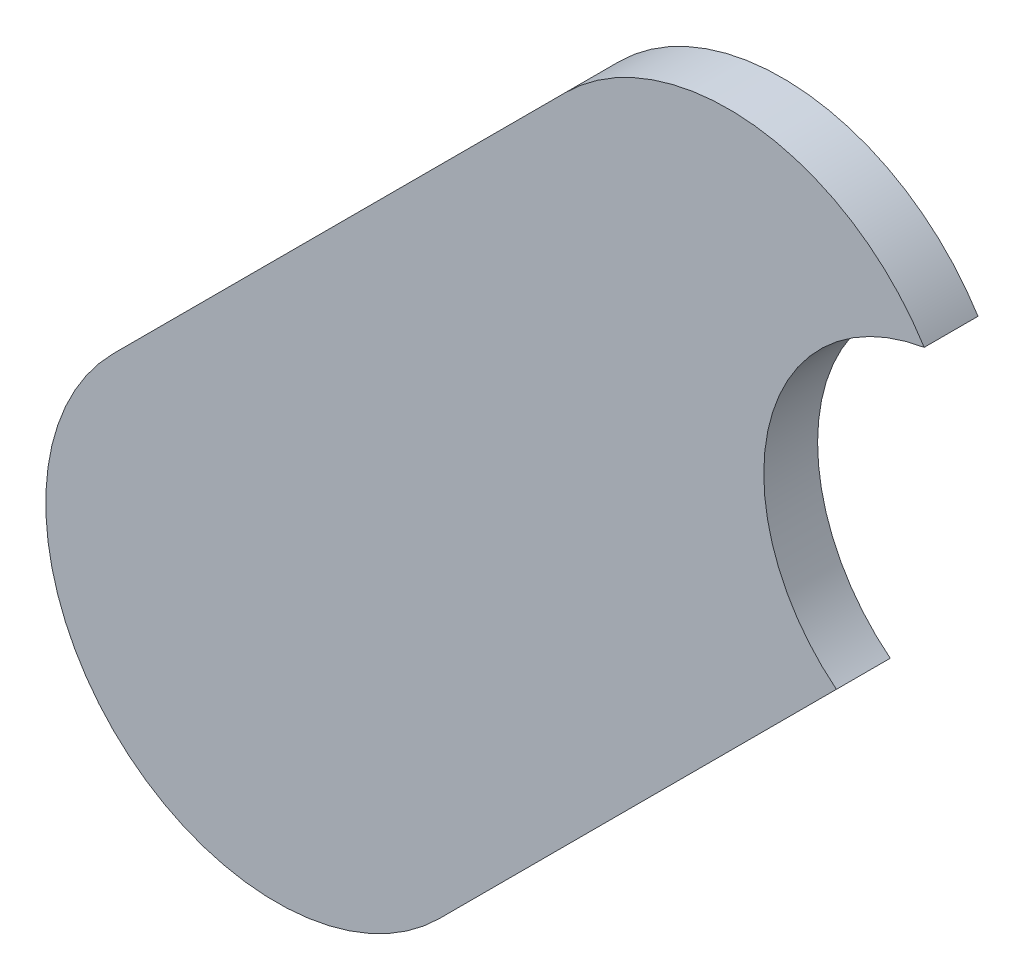
ISO-10303-21;
HEADER;
FILE_DESCRIPTION(('STEP AP214'),'2;1');
FILE_NAME('part.step','',(''),(''),'','','');
FILE_SCHEMA(('AUTOMOTIVE_DESIGN { 1 0 10303 214 1 1 1 1 }'));
ENDSEC;
DATA;
#1=APPLICATION_CONTEXT('core data for automotive mechanical design processes');
#2=APPLICATION_PROTOCOL_DEFINITION('international standard','automotive_design',2000,#1);
#3=PRODUCT_CONTEXT('',#1,'mechanical');
#4=PRODUCT('Part','Part','',(#3));
#5=PRODUCT_RELATED_PRODUCT_CATEGORY('part','',(#4));
#6=PRODUCT_DEFINITION_FORMATION('','',#4);
#7=PRODUCT_DEFINITION_CONTEXT('part definition',#1,'design');
#8=PRODUCT_DEFINITION('design','',#6,#7);
#9=PRODUCT_DEFINITION_SHAPE('','',#8);
#10=(LENGTH_UNIT() NAMED_UNIT(*) SI_UNIT(.MILLI.,.METRE.));
#11=(NAMED_UNIT(*) PLANE_ANGLE_UNIT() SI_UNIT($,.RADIAN.));
#12=(NAMED_UNIT(*) SI_UNIT($,.STERADIAN.) SOLID_ANGLE_UNIT());
#13=UNCERTAINTY_MEASURE_WITH_UNIT(LENGTH_MEASURE(1.E-05),#10,'distance_accuracy_value','');
#14=(GEOMETRIC_REPRESENTATION_CONTEXT(3) GLOBAL_UNCERTAINTY_ASSIGNED_CONTEXT((#13)) GLOBAL_UNIT_ASSIGNED_CONTEXT((#10,
#11,#12)) REPRESENTATION_CONTEXT('',''));
#15=CARTESIAN_POINT('',(0.,0.,0.));
#16=DIRECTION('',(0.,0.,1.));
#17=DIRECTION('',(1.,0.,0.));
#18=AXIS2_PLACEMENT_3D('',#15,#16,#17);
#19=CARTESIAN_POINT('',(130.2699995,-115.2599995,1.6));
#20=DIRECTION('',(0.,0.,-1.));
#21=DIRECTION('',(0.707106781186548,-0.707106781186548,0.));
#22=AXIS2_PLACEMENT_3D('',#19,#20,#21);
#23=CYLINDRICAL_SURFACE('',#22,0.150000682813);
#24=DIRECTION('',(0.,0.,1.));
#25=VECTOR('',#24,1.);
#26=CARTESIAN_POINT('',(130.163933,-115.153933,1.6));
#27=LINE('',#26,#25);
#28=CARTESIAN_POINT('',(130.163933,-115.153933,1.6));
#29=VERTEX_POINT('',#28);
#30=CARTESIAN_POINT('',(130.163933,-115.153933,1.635));
#31=VERTEX_POINT('',#30);
#32=EDGE_CURVE('E11',#29,#31,#27,.T.);
#33=ORIENTED_EDGE('',*,*,#32,.T.);
#34=CARTESIAN_POINT('',(130.2699995,-115.2599995,1.635));
#35=DIRECTION('',(0.,0.,1.));
#36=DIRECTION('',(0.707106781186548,-0.707106781186548,0.));
#37=AXIS2_PLACEMENT_3D('',#34,#35,#36);
#38=CIRCLE('',#37,0.150000682813);
#39=CARTESIAN_POINT('',(130.39733726335,-115.1807196231,1.635));
#40=VERTEX_POINT('',#39);
#41=EDGE_CURVE('E79',#40,#31,#38,.T.);
#42=ORIENTED_EDGE('',*,*,#41,.F.);
#43=DIRECTION('',(0.,0.,-1.));
#44=VECTOR('',#43,1.);
#45=CARTESIAN_POINT('',(130.39733726334,-115.1807196231,1.6));
#46=LINE('',#45,#44);
#47=CARTESIAN_POINT('',(130.39733726335,-115.1807196231,1.6));
#48=VERTEX_POINT('',#47);
#49=EDGE_CURVE('E73',#40,#48,#46,.T.);
#50=ORIENTED_EDGE('',*,*,#49,.T.);
#51=CARTESIAN_POINT('',(130.2699995,-115.2599995,1.6));
#52=DIRECTION('',(0.,0.,1.));
#53=DIRECTION('',(0.707106781186548,-0.707106781186548,0.));
#54=AXIS2_PLACEMENT_3D('',#51,#52,#53);
#55=CIRCLE('',#54,0.150000682813);
#56=EDGE_CURVE('E76',#48,#29,#55,.T.);
#57=ORIENTED_EDGE('',*,*,#56,.T.);
#58=EDGE_LOOP('',(#33,#42,#50,#57));
#59=FACE_BOUND('',#58,.T.);
#60=ADVANCED_FACE('F17',(#59),#23,.T.);
#61=CARTESIAN_POINT('',(130.163933,-115.153933,1.6));
#62=DIRECTION('',(0.707106781186548,-0.707106781186548,0.));
#63=DIRECTION('',(0.,0.,-1.));
#64=AXIS2_PLACEMENT_3D('',#61,#62,#63);
#65=PLANE('',#64);
#66=DIRECTION('',(-0.707106781186548,-0.707106781186548,0.));
#67=VECTOR('',#66,1.);
#68=CARTESIAN_POINT('',(130.163933,-115.153933,1.6));
#69=LINE('',#68,#67);
#70=CARTESIAN_POINT('',(129.869933,-115.447933,1.6));
#71=VERTEX_POINT('',#70);
#72=EDGE_CURVE('E100',#29,#71,#69,.T.);
#73=ORIENTED_EDGE('',*,*,#72,.T.);
#74=DIRECTION('',(0.,0.,1.));
#75=VECTOR('',#74,1.);
#76=CARTESIAN_POINT('',(129.869933,-115.447933,1.6));
#77=LINE('',#76,#75);
#78=CARTESIAN_POINT('',(129.869933,-115.447933,1.635));
#79=VERTEX_POINT('',#78);
#80=EDGE_CURVE('E25',#71,#79,#77,.T.);
#81=ORIENTED_EDGE('',*,*,#80,.T.);
#82=DIRECTION('',(-0.707106781186548,-0.707106781186548,0.));
#83=VECTOR('',#82,1.);
#84=CARTESIAN_POINT('',(130.163933,-115.153933,1.635));
#85=LINE('',#84,#83);
#86=EDGE_CURVE('E115',#31,#79,#85,.T.);
#87=ORIENTED_EDGE('',*,*,#86,.F.);
#88=ORIENTED_EDGE('',*,*,#32,.F.);
#89=EDGE_LOOP('',(#73,#81,#87,#88));
#90=FACE_BOUND('',#89,.T.);
#91=ADVANCED_FACE('F184',(#90),#65,.F.);
#92=CARTESIAN_POINT('',(129.9759995,-115.5539995,1.6));
#93=DIRECTION('',(0.,0.,-1.));
#94=DIRECTION('',(-0.707106781186548,0.707106781186548,0.));
#95=AXIS2_PLACEMENT_3D('',#92,#93,#94);
#96=CYLINDRICAL_SURFACE('',#95,0.150000682813);
#97=CARTESIAN_POINT('',(129.9759995,-115.5539995,1.6));
#98=DIRECTION('',(0.,0.,1.));
#99=DIRECTION('',(-0.707106781186548,0.707106781186548,0.));
#100=AXIS2_PLACEMENT_3D('',#97,#98,#99);
#101=CIRCLE('',#100,0.150000682813);
#102=CARTESIAN_POINT('',(130.082066,-115.660066,1.6));
#103=VERTEX_POINT('',#102);
#104=EDGE_CURVE('E96',#71,#103,#101,.T.);
#105=ORIENTED_EDGE('',*,*,#104,.T.);
#106=DIRECTION('',(0.,0.,1.));
#107=VECTOR('',#106,1.);
#108=CARTESIAN_POINT('',(130.082066,-115.660066,1.6));
#109=LINE('',#108,#107);
#110=CARTESIAN_POINT('',(130.082066,-115.660066,1.635));
#111=VERTEX_POINT('',#110);
#112=EDGE_CURVE('E157',#103,#111,#109,.T.);
#113=ORIENTED_EDGE('',*,*,#112,.T.);
#114=CARTESIAN_POINT('',(129.9759995,-115.5539995,1.635));
#115=DIRECTION('',(0.,0.,1.));
#116=DIRECTION('',(-0.707106781186548,0.707106781186548,0.));
#117=AXIS2_PLACEMENT_3D('',#114,#115,#116);
#118=CIRCLE('',#117,0.150000682813);
#119=EDGE_CURVE('E84',#79,#111,#118,.T.);
#120=ORIENTED_EDGE('',*,*,#119,.F.);
#121=ORIENTED_EDGE('',*,*,#80,.F.);
#122=EDGE_LOOP('',(#105,#113,#120,#121));
#123=FACE_BOUND('',#122,.T.);
#124=ADVANCED_FACE('F200',(#123),#96,.T.);
#125=CARTESIAN_POINT('',(130.082066,-115.660066,1.635));
#126=DIRECTION('',(0.,0.,1.));
#127=DIRECTION('',(1.,0.,0.));
#128=AXIS2_PLACEMENT_3D('',#125,#126,#127);
#129=PLANE('',#128);
#130=ORIENTED_EDGE('',*,*,#119,.T.);
#131=DIRECTION('',(0.707106781186548,0.707106781186548,0.));
#132=VECTOR('',#131,1.);
#133=CARTESIAN_POINT('',(130.082066,-115.660066,1.635));
#134=LINE('',#133,#132);
#135=CARTESIAN_POINT('',(130.34025270008,-115.4018792999,1.635));
#136=VERTEX_POINT('',#135);
#137=EDGE_CURVE('E162',#111,#136,#134,.T.);
#138=ORIENTED_EDGE('',*,*,#137,.T.);
#139=CARTESIAN_POINT('',(130.418,-115.304,1.635));
#140=DIRECTION('',(0.,0.,-1.));
#141=DIRECTION('',(0.,-1.,0.));
#142=AXIS2_PLACEMENT_3D('',#139,#140,#141);
#143=CIRCLE('',#142,0.125);
#144=EDGE_CURVE('E85',#136,#40,#143,.T.);
#145=ORIENTED_EDGE('',*,*,#144,.T.);
#146=ORIENTED_EDGE('',*,*,#41,.T.);
#147=ORIENTED_EDGE('',*,*,#86,.T.);
#148=EDGE_LOOP('',(#130,#138,#145,#146,#147));
#149=FACE_BOUND('',#148,.T.);
#150=ADVANCED_FACE('F187',(#149),#129,.T.);
#151=CARTESIAN_POINT('',(130.418,-115.304,-0.045));
#152=DIRECTION('',(0.,0.,-1.));
#153=DIRECTION('',(0.,-1.,0.));
#154=AXIS2_PLACEMENT_3D('',#151,#152,#153);
#155=CYLINDRICAL_SURFACE('',#154,0.125);
#156=ORIENTED_EDGE('',*,*,#144,.F.);
#157=DIRECTION('',(0.,0.,-1.));
#158=VECTOR('',#157,1.);
#159=CARTESIAN_POINT('',(130.34025270007,-115.4018792999,-0.045));
#160=LINE('',#159,#158);
#161=CARTESIAN_POINT('',(130.34025270008,-115.4018792999,1.6));
#162=VERTEX_POINT('',#161);
#163=EDGE_CURVE('E91',#136,#162,#160,.T.);
#164=ORIENTED_EDGE('',*,*,#163,.T.);
#165=CARTESIAN_POINT('',(130.418,-115.304,1.6));
#166=DIRECTION('',(0.,0.,-1.));
#167=DIRECTION('',(0.,-1.,0.));
#168=AXIS2_PLACEMENT_3D('',#165,#166,#167);
#169=CIRCLE('',#168,0.125);
#170=EDGE_CURVE('E88',#162,#48,#169,.T.);
#171=ORIENTED_EDGE('',*,*,#170,.T.);
#172=ORIENTED_EDGE('',*,*,#49,.F.);
#173=EDGE_LOOP('',(#156,#164,#171,#172));
#174=FACE_BOUND('',#173,.T.);
#175=ADVANCED_FACE('F89',(#174),#155,.F.);
#176=CARTESIAN_POINT('',(130.082066,-115.660066,1.6));
#177=DIRECTION('',(0.,0.,1.));
#178=DIRECTION('',(1.,0.,0.));
#179=AXIS2_PLACEMENT_3D('',#176,#177,#178);
#180=PLANE('',#179);
#181=ORIENTED_EDGE('',*,*,#72,.F.);
#182=ORIENTED_EDGE('',*,*,#56,.F.);
#183=ORIENTED_EDGE('',*,*,#170,.F.);
#184=DIRECTION('',(0.707106781186548,0.707106781186548,0.));
#185=VECTOR('',#184,1.);
#186=CARTESIAN_POINT('',(130.082066,-115.660066,1.6));
#187=LINE('',#186,#185);
#188=EDGE_CURVE('E107',#103,#162,#187,.T.);
#189=ORIENTED_EDGE('',*,*,#188,.F.);
#190=ORIENTED_EDGE('',*,*,#104,.F.);
#191=EDGE_LOOP('',(#181,#182,#183,#189,#190));
#192=FACE_BOUND('',#191,.T.);
#193=ADVANCED_FACE('F98',(#192),#180,.F.);
#194=CARTESIAN_POINT('',(130.082066,-115.660066,1.6));
#195=DIRECTION('',(-0.707106781186548,0.707106781186548,0.));
#196=DIRECTION('',(0.,0.,1.));
#197=AXIS2_PLACEMENT_3D('',#194,#195,#196);
#198=PLANE('',#197);
#199=ORIENTED_EDGE('',*,*,#163,.F.);
#200=ORIENTED_EDGE('',*,*,#137,.F.);
#201=ORIENTED_EDGE('',*,*,#112,.F.);
#202=ORIENTED_EDGE('',*,*,#188,.T.);
#203=EDGE_LOOP('',(#199,#200,#201,#202));
#204=FACE_BOUND('',#203,.T.);
#205=ADVANCED_FACE('F181',(#204),#198,.F.);
#206=CLOSED_SHELL('',(#60,#91,#124,#150,#175,#193,#205));
#207=MANIFOLD_SOLID_BREP('B1',#206);
#208=ADVANCED_BREP_SHAPE_REPRESENTATION('',(#18,#207),#14);
#209=SHAPE_DEFINITION_REPRESENTATION(#9,#208);
ENDSEC;
END-ISO-10303-21;
